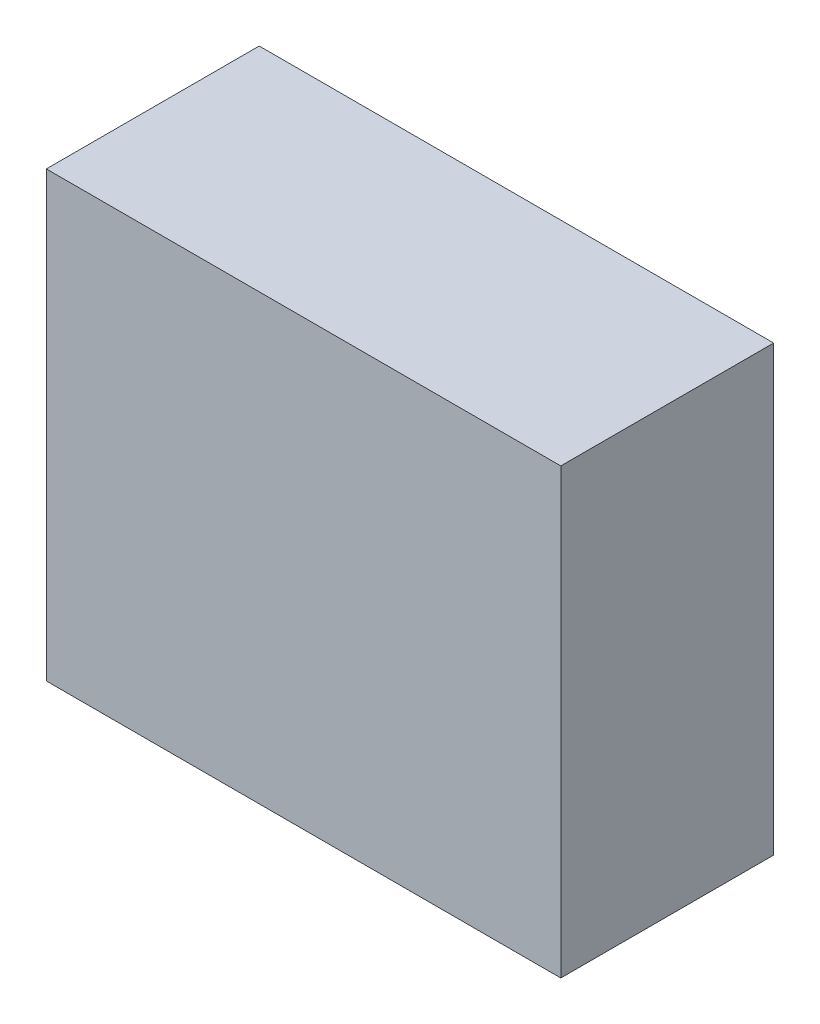
ISO-10303-21;
HEADER;
FILE_DESCRIPTION(('STEP AP214'),'2;1');
FILE_NAME('part.step','',(''),(''),'','','');
FILE_SCHEMA(('AUTOMOTIVE_DESIGN { 1 0 10303 214 1 1 1 1 }'));
ENDSEC;
DATA;
#1=APPLICATION_CONTEXT('core data for automotive mechanical design processes');
#2=APPLICATION_PROTOCOL_DEFINITION('international standard','automotive_design',2000,#1);
#3=PRODUCT_CONTEXT('',#1,'mechanical');
#4=PRODUCT('Part','Part','',(#3));
#5=PRODUCT_RELATED_PRODUCT_CATEGORY('part','',(#4));
#6=PRODUCT_DEFINITION_FORMATION('','',#4);
#7=PRODUCT_DEFINITION_CONTEXT('part definition',#1,'design');
#8=PRODUCT_DEFINITION('design','',#6,#7);
#9=PRODUCT_DEFINITION_SHAPE('','',#8);
#10=(LENGTH_UNIT() NAMED_UNIT(*) SI_UNIT(.MILLI.,.METRE.));
#11=(NAMED_UNIT(*) PLANE_ANGLE_UNIT() SI_UNIT($,.RADIAN.));
#12=(NAMED_UNIT(*) SI_UNIT($,.STERADIAN.) SOLID_ANGLE_UNIT());
#13=UNCERTAINTY_MEASURE_WITH_UNIT(LENGTH_MEASURE(1.E-05),#10,'distance_accuracy_value','');
#14=(GEOMETRIC_REPRESENTATION_CONTEXT(3) GLOBAL_UNCERTAINTY_ASSIGNED_CONTEXT((#13)) GLOBAL_UNIT_ASSIGNED_CONTEXT((#10,
#11,#12)) REPRESENTATION_CONTEXT('',''));
#15=CARTESIAN_POINT('',(0.,0.,0.));
#16=DIRECTION('',(0.,0.,1.));
#17=DIRECTION('',(1.,0.,0.));
#18=AXIS2_PLACEMENT_3D('',#15,#16,#17);
#19=CARTESIAN_POINT('',(0.,25.,0.));
#20=DIRECTION('',(1.,0.,0.));
#21=DIRECTION('',(0.,0.,-1.));
#22=AXIS2_PLACEMENT_3D('',#19,#20,#21);
#23=PLANE('',#22);
#24=DIRECTION('',(0.,0.,1.));
#25=VECTOR('',#24,1.);
#26=CARTESIAN_POINT('',(0.,0.,0.));
#27=LINE('',#26,#25);
#28=CARTESIAN_POINT('',(0.,0.,-12.));
#29=VERTEX_POINT('',#28);
#30=CARTESIAN_POINT('',(0.,0.,0.));
#31=VERTEX_POINT('',#30);
#32=EDGE_CURVE('E96',#29,#31,#27,.T.);
#33=ORIENTED_EDGE('',*,*,#32,.T.);
#34=DIRECTION('',(0.,-1.,0.));
#35=VECTOR('',#34,1.);
#36=CARTESIAN_POINT('',(0.,25.,0.));
#37=LINE('',#36,#35);
#38=CARTESIAN_POINT('',(0.,25.,0.));
#39=VERTEX_POINT('',#38);
#40=EDGE_CURVE('E11',#39,#31,#37,.T.);
#41=ORIENTED_EDGE('',*,*,#40,.F.);
#42=DIRECTION('',(0.,0.,1.));
#43=VECTOR('',#42,1.);
#44=CARTESIAN_POINT('',(0.,25.,0.));
#45=LINE('',#44,#43);
#46=CARTESIAN_POINT('',(0.,25.,-12.));
#47=VERTEX_POINT('',#46);
#48=EDGE_CURVE('E84',#47,#39,#45,.T.);
#49=ORIENTED_EDGE('',*,*,#48,.F.);
#50=DIRECTION('',(0.,-1.,0.));
#51=VECTOR('',#50,1.);
#52=CARTESIAN_POINT('',(0.,25.,-12.));
#53=LINE('',#52,#51);
#54=EDGE_CURVE('E92',#47,#29,#53,.T.);
#55=ORIENTED_EDGE('',*,*,#54,.T.);
#56=EDGE_LOOP('',(#33,#41,#49,#55));
#57=FACE_BOUND('',#56,.T.);
#58=ADVANCED_FACE('F33',(#57),#23,.F.);
#59=CARTESIAN_POINT('',(0.,25.,0.));
#60=DIRECTION('',(0.,0.,-1.));
#61=DIRECTION('',(-1.,0.,0.));
#62=AXIS2_PLACEMENT_3D('',#59,#60,#61);
#63=PLANE('',#62);
#64=DIRECTION('',(1.,0.,0.));
#65=VECTOR('',#64,1.);
#66=CARTESIAN_POINT('',(0.,0.,0.));
#67=LINE('',#66,#65);
#68=CARTESIAN_POINT('',(29.,0.,0.));
#69=VERTEX_POINT('',#68);
#70=EDGE_CURVE('E88',#31,#69,#67,.T.);
#71=ORIENTED_EDGE('',*,*,#70,.T.);
#72=DIRECTION('',(0.,-1.,0.));
#73=VECTOR('',#72,1.);
#74=CARTESIAN_POINT('',(29.,25.,0.));
#75=LINE('',#74,#73);
#76=CARTESIAN_POINT('',(29.,25.,0.));
#77=VERTEX_POINT('',#76);
#78=EDGE_CURVE('E41',#77,#69,#75,.T.);
#79=ORIENTED_EDGE('',*,*,#78,.F.);
#80=DIRECTION('',(1.,0.,0.));
#81=VECTOR('',#80,1.);
#82=CARTESIAN_POINT('',(0.,25.,0.));
#83=LINE('',#82,#81);
#84=EDGE_CURVE('E79',#39,#77,#83,.T.);
#85=ORIENTED_EDGE('',*,*,#84,.F.);
#86=ORIENTED_EDGE('',*,*,#40,.T.);
#87=EDGE_LOOP('',(#71,#79,#85,#86));
#88=FACE_BOUND('',#87,.T.);
#89=ADVANCED_FACE('F87',(#88),#63,.F.);
#90=CARTESIAN_POINT('',(29.,25.,0.));
#91=DIRECTION('',(-1.,0.,0.));
#92=DIRECTION('',(0.,0.,1.));
#93=AXIS2_PLACEMENT_3D('',#90,#91,#92);
#94=PLANE('',#93);
#95=DIRECTION('',(0.,0.,-1.));
#96=VECTOR('',#95,1.);
#97=CARTESIAN_POINT('',(29.,0.,0.));
#98=LINE('',#97,#96);
#99=CARTESIAN_POINT('',(29.,0.,-12.));
#100=VERTEX_POINT('',#99);
#101=EDGE_CURVE('E66',#69,#100,#98,.T.);
#102=ORIENTED_EDGE('',*,*,#101,.T.);
#103=DIRECTION('',(0.,-1.,0.));
#104=VECTOR('',#103,1.);
#105=CARTESIAN_POINT('',(29.,25.,-12.));
#106=LINE('',#105,#104);
#107=CARTESIAN_POINT('',(29.,25.,-12.));
#108=VERTEX_POINT('',#107);
#109=EDGE_CURVE('E89',#108,#100,#106,.T.);
#110=ORIENTED_EDGE('',*,*,#109,.F.);
#111=DIRECTION('',(0.,0.,-1.));
#112=VECTOR('',#111,1.);
#113=CARTESIAN_POINT('',(29.,25.,0.));
#114=LINE('',#113,#112);
#115=EDGE_CURVE('E82',#77,#108,#114,.T.);
#116=ORIENTED_EDGE('',*,*,#115,.F.);
#117=ORIENTED_EDGE('',*,*,#78,.T.);
#118=EDGE_LOOP('',(#102,#110,#116,#117));
#119=FACE_BOUND('',#118,.T.);
#120=ADVANCED_FACE('F90',(#119),#94,.F.);
#121=CARTESIAN_POINT('',(0.,25.,-12.));
#122=DIRECTION('',(0.,0.,1.));
#123=DIRECTION('',(1.,0.,0.));
#124=AXIS2_PLACEMENT_3D('',#121,#122,#123);
#125=PLANE('',#124);
#126=DIRECTION('',(-1.,0.,0.));
#127=VECTOR('',#126,1.);
#128=CARTESIAN_POINT('',(0.,0.,-12.));
#129=LINE('',#128,#127);
#130=EDGE_CURVE('E72',#100,#29,#129,.T.);
#131=ORIENTED_EDGE('',*,*,#130,.T.);
#132=ORIENTED_EDGE('',*,*,#54,.F.);
#133=DIRECTION('',(-1.,0.,0.));
#134=VECTOR('',#133,1.);
#135=CARTESIAN_POINT('',(0.,25.,-12.));
#136=LINE('',#135,#134);
#137=EDGE_CURVE('E49',#108,#47,#136,.T.);
#138=ORIENTED_EDGE('',*,*,#137,.F.);
#139=ORIENTED_EDGE('',*,*,#109,.T.);
#140=EDGE_LOOP('',(#131,#132,#138,#139));
#141=FACE_BOUND('',#140,.T.);
#142=ADVANCED_FACE('F103',(#141),#125,.F.);
#143=CARTESIAN_POINT('',(0.,25.,0.));
#144=DIRECTION('',(0.,-1.,0.));
#145=DIRECTION('',(0.,0.,-1.));
#146=AXIS2_PLACEMENT_3D('',#143,#144,#145);
#147=PLANE('',#146);
#148=ORIENTED_EDGE('',*,*,#48,.T.);
#149=ORIENTED_EDGE('',*,*,#84,.T.);
#150=ORIENTED_EDGE('',*,*,#115,.T.);
#151=ORIENTED_EDGE('',*,*,#137,.T.);
#152=EDGE_LOOP('',(#148,#149,#150,#151));
#153=FACE_BOUND('',#152,.T.);
#154=ADVANCED_FACE('F80',(#153),#147,.F.);
#155=CARTESIAN_POINT('',(0.,0.,0.));
#156=DIRECTION('',(0.,-1.,0.));
#157=DIRECTION('',(0.,0.,-1.));
#158=AXIS2_PLACEMENT_3D('',#155,#156,#157);
#159=PLANE('',#158);
#160=ORIENTED_EDGE('',*,*,#32,.F.);
#161=ORIENTED_EDGE('',*,*,#130,.F.);
#162=ORIENTED_EDGE('',*,*,#101,.F.);
#163=ORIENTED_EDGE('',*,*,#70,.F.);
#164=EDGE_LOOP('',(#160,#161,#162,#163));
#165=FACE_BOUND('',#164,.T.);
#166=ADVANCED_FACE('F106',(#165),#159,.T.);
#167=CLOSED_SHELL('',(#58,#89,#120,#142,#154,#166));
#168=MANIFOLD_SOLID_BREP('B2',#167);
#169=ADVANCED_BREP_SHAPE_REPRESENTATION('',(#18,#168),#14);
#170=SHAPE_DEFINITION_REPRESENTATION(#9,#169);
ENDSEC;
END-ISO-10303-21;
